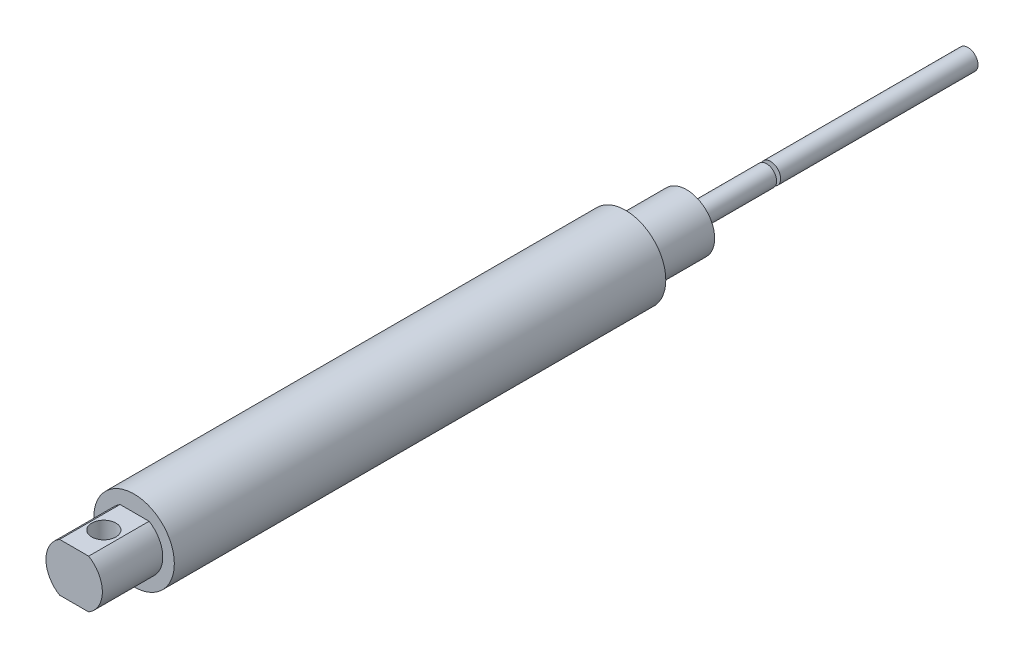
ISO-10303-21;
HEADER;
FILE_DESCRIPTION(('STEP AP214'),'2;1');
FILE_NAME('part.step','',(''),(''),'','','');
FILE_SCHEMA(('AUTOMOTIVE_DESIGN { 1 0 10303 214 1 1 1 1 }'));
ENDSEC;
DATA;
#1=APPLICATION_CONTEXT('core data for automotive mechanical design processes');
#2=APPLICATION_PROTOCOL_DEFINITION('international standard','automotive_design',2000,#1);
#3=PRODUCT_CONTEXT('',#1,'mechanical');
#4=PRODUCT('Part','Part','',(#3));
#5=PRODUCT_RELATED_PRODUCT_CATEGORY('part','',(#4));
#6=PRODUCT_DEFINITION_FORMATION('','',#4);
#7=PRODUCT_DEFINITION_CONTEXT('part definition',#1,'design');
#8=PRODUCT_DEFINITION('design','',#6,#7);
#9=PRODUCT_DEFINITION_SHAPE('','',#8);
#10=(LENGTH_UNIT() NAMED_UNIT(*) SI_UNIT(.MILLI.,.METRE.));
#11=(NAMED_UNIT(*) PLANE_ANGLE_UNIT() SI_UNIT($,.RADIAN.));
#12=(NAMED_UNIT(*) SI_UNIT($,.STERADIAN.) SOLID_ANGLE_UNIT());
#13=UNCERTAINTY_MEASURE_WITH_UNIT(LENGTH_MEASURE(1.E-05),#10,'distance_accuracy_value','');
#14=(GEOMETRIC_REPRESENTATION_CONTEXT(3) GLOBAL_UNCERTAINTY_ASSIGNED_CONTEXT((#13)) GLOBAL_UNIT_ASSIGNED_CONTEXT((#10,
#11,#12)) REPRESENTATION_CONTEXT('',''));
#15=CARTESIAN_POINT('',(0.,0.,0.));
#16=DIRECTION('',(0.,0.,1.));
#17=DIRECTION('',(1.,0.,0.));
#18=AXIS2_PLACEMENT_3D('',#15,#16,#17);
#19=CARTESIAN_POINT('',(0.,0.,-70.));
#20=DIRECTION('',(0.,0.,1.));
#21=DIRECTION('',(1.,0.,0.));
#22=AXIS2_PLACEMENT_3D('',#19,#20,#21);
#23=CYLINDRICAL_SURFACE('',#22,2.5);
#24=CARTESIAN_POINT('',(0.,0.,-70.));
#25=DIRECTION('',(0.,0.,-1.));
#26=DIRECTION('',(-1.,0.,0.));
#27=AXIS2_PLACEMENT_3D('',#24,#25,#26);
#28=CIRCLE('',#27,2.5);
#29=CARTESIAN_POINT('',(-2.5,0.,-70.));
#30=VERTEX_POINT('',#29);
#31=EDGE_CURVE('E12',#30,#30,#28,.T.);
#32=ORIENTED_EDGE('',*,*,#31,.F.);
#33=EDGE_LOOP('',(#32));
#34=FACE_BOUND('',#33,.T.);
#35=CARTESIAN_POINT('',(0.,0.,-21.));
#36=DIRECTION('',(0.,0.,-1.));
#37=DIRECTION('',(-1.,0.,0.));
#38=AXIS2_PLACEMENT_3D('',#35,#36,#37);
#39=CIRCLE('',#38,2.5);
#40=CARTESIAN_POINT('',(-2.5,0.,-21.));
#41=VERTEX_POINT('',#40);
#42=EDGE_CURVE('E58',#41,#41,#39,.T.);
#43=ORIENTED_EDGE('',*,*,#42,.T.);
#44=EDGE_LOOP('',(#43));
#45=FACE_BOUND('',#44,.T.);
#46=ADVANCED_FACE('F55',(#34,#45),#23,.T.);
#47=CARTESIAN_POINT('',(0.,0.,-70.));
#48=DIRECTION('',(0.,0.,-1.));
#49=DIRECTION('',(-1.,0.,0.));
#50=AXIS2_PLACEMENT_3D('',#47,#48,#49);
#51=PLANE('',#50);
#52=ORIENTED_EDGE('',*,*,#31,.T.);
#53=EDGE_LOOP('',(#52));
#54=FACE_BOUND('',#53,.T.);
#55=ADVANCED_FACE('F70',(#54),#51,.T.);
#56=CARTESIAN_POINT('',(0.,0.,-21.));
#57=DIRECTION('',(0.,0.,-1.));
#58=DIRECTION('',(-1.,0.,0.));
#59=AXIS2_PLACEMENT_3D('',#56,#57,#58);
#60=PLANE('',#59);
#61=ORIENTED_EDGE('',*,*,#42,.F.);
#62=EDGE_LOOP('',(#61));
#63=FACE_BOUND('',#62,.T.);
#64=ADVANCED_FACE('F68',(#63),#60,.F.);
#65=CLOSED_SHELL('',(#46,#55,#64));
#66=MANIFOLD_SOLID_BREP('B2',#65);
#67=CARTESIAN_POINT('',(0.,0.,152.));
#68=DIRECTION('',(0.,0.,-1.));
#69=DIRECTION('',(-1.,0.,0.));
#70=AXIS2_PLACEMENT_3D('',#67,#68,#69);
#71=CYLINDRICAL_SURFACE('',#70,10.);
#72=CARTESIAN_POINT('',(0.,0.,15.));
#73=DIRECTION('',(0.,0.,1.));
#74=DIRECTION('',(1.,0.,0.));
#75=AXIS2_PLACEMENT_3D('',#72,#73,#74);
#76=CIRCLE('',#75,10.);
#77=CARTESIAN_POINT('',(10.,0.,15.));
#78=VERTEX_POINT('',#77);
#79=EDGE_CURVE('E177',#78,#78,#76,.T.);
#80=ORIENTED_EDGE('',*,*,#79,.T.);
#81=EDGE_LOOP('',(#80));
#82=FACE_BOUND('',#81,.T.);
#83=CARTESIAN_POINT('',(0.,0.,137.));
#84=DIRECTION('',(0.,0.,1.));
#85=DIRECTION('',(1.,0.,0.));
#86=AXIS2_PLACEMENT_3D('',#83,#84,#85);
#87=CIRCLE('',#86,10.);
#88=CARTESIAN_POINT('',(10.,0.,137.));
#89=VERTEX_POINT('',#88);
#90=EDGE_CURVE('E171',#89,#89,#87,.T.);
#91=ORIENTED_EDGE('',*,*,#90,.F.);
#92=EDGE_LOOP('',(#91));
#93=FACE_BOUND('',#92,.T.);
#94=ADVANCED_FACE('F102',(#82,#93),#71,.T.);
#95=CARTESIAN_POINT('',(0.,6.,137.));
#96=DIRECTION('',(0.,-1.,0.));
#97=DIRECTION('',(0.,0.,-1.));
#98=AXIS2_PLACEMENT_3D('',#95,#96,#97);
#99=PLANE('',#98);
#100=CARTESIAN_POINT('',(0.,6.,144.5));
#101=DIRECTION('',(0.,1.,0.));
#102=DIRECTION('',(0.,0.,1.));
#103=AXIS2_PLACEMENT_3D('',#100,#101,#102);
#104=CIRCLE('',#103,3.00000000000001);
#105=CARTESIAN_POINT('',(0.,6.,147.5));
#106=VERTEX_POINT('',#105);
#107=EDGE_CURVE('E216',#106,#106,#104,.T.);
#108=ORIENTED_EDGE('',*,*,#107,.F.);
#109=EDGE_LOOP('',(#108));
#110=FACE_BOUND('',#109,.T.);
#111=DIRECTION('',(1.,0.,0.));
#112=VECTOR('',#111,1.);
#113=CARTESIAN_POINT('',(0.,6.,152.));
#114=LINE('',#113,#112);
#115=CARTESIAN_POINT('',(-3.47445059044201,6.,152.));
#116=VERTEX_POINT('',#115);
#117=CARTESIAN_POINT('',(3.73665196048596,6.,152.));
#118=VERTEX_POINT('',#117);
#119=EDGE_CURVE('E118',#116,#118,#114,.T.);
#120=ORIENTED_EDGE('',*,*,#119,.T.);
#121=DIRECTION('',(0.,0.,1.));
#122=VECTOR('',#121,1.);
#123=CARTESIAN_POINT('',(3.73665196048596,6.,137.));
#124=LINE('',#123,#122);
#125=CARTESIAN_POINT('',(3.73665196048596,6.,137.));
#126=VERTEX_POINT('',#125);
#127=EDGE_CURVE('E162',#126,#118,#124,.T.);
#128=ORIENTED_EDGE('',*,*,#127,.F.);
#129=DIRECTION('',(1.,0.,0.));
#130=VECTOR('',#129,1.);
#131=CARTESIAN_POINT('',(0.,6.,137.));
#132=LINE('',#131,#130);
#133=CARTESIAN_POINT('',(-3.47445059044201,6.,137.));
#134=VERTEX_POINT('',#133);
#135=EDGE_CURVE('E167',#134,#126,#132,.T.);
#136=ORIENTED_EDGE('',*,*,#135,.F.);
#137=DIRECTION('',(0.,0.,1.));
#138=VECTOR('',#137,1.);
#139=CARTESIAN_POINT('',(-3.47445059044201,6.,137.));
#140=LINE('',#139,#138);
#141=EDGE_CURVE('E110',#134,#116,#140,.T.);
#142=ORIENTED_EDGE('',*,*,#141,.T.);
#143=EDGE_LOOP('',(#120,#128,#136,#142));
#144=FACE_BOUND('',#143,.T.);
#145=ADVANCED_FACE('F199',(#110,#144),#99,.F.);
#146=CARTESIAN_POINT('',(0.131100685021975,0.,137.));
#147=DIRECTION('',(0.,0.,1.));
#148=DIRECTION('',(1.,0.,0.));
#149=AXIS2_PLACEMENT_3D('',#146,#147,#148);
#150=CYLINDRICAL_SURFACE('',#149,7.);
#151=CARTESIAN_POINT('',(0.131100685021975,0.,152.));
#152=DIRECTION('',(0.,0.,1.));
#153=DIRECTION('',(1.,0.,0.));
#154=AXIS2_PLACEMENT_3D('',#151,#152,#153);
#155=CIRCLE('',#154,7.);
#156=CARTESIAN_POINT('',(-3.47445059044201,-6.,152.));
#157=VERTEX_POINT('',#156);
#158=EDGE_CURVE('E169',#116,#157,#155,.T.);
#159=ORIENTED_EDGE('',*,*,#158,.F.);
#160=ORIENTED_EDGE('',*,*,#141,.F.);
#161=CARTESIAN_POINT('',(0.131100685021975,0.,137.));
#162=DIRECTION('',(0.,0.,1.));
#163=DIRECTION('',(1.,0.,0.));
#164=AXIS2_PLACEMENT_3D('',#161,#162,#163);
#165=CIRCLE('',#164,7.);
#166=CARTESIAN_POINT('',(-3.47445059044201,-6.,137.));
#167=VERTEX_POINT('',#166);
#168=EDGE_CURVE('E156',#134,#167,#165,.T.);
#169=ORIENTED_EDGE('',*,*,#168,.T.);
#170=DIRECTION('',(0.,0.,1.));
#171=VECTOR('',#170,1.);
#172=CARTESIAN_POINT('',(-3.47445059044201,-6.,137.));
#173=LINE('',#172,#171);
#174=EDGE_CURVE('E154',#167,#157,#173,.T.);
#175=ORIENTED_EDGE('',*,*,#174,.T.);
#176=EDGE_LOOP('',(#159,#160,#169,#175));
#177=FACE_BOUND('',#176,.T.);
#178=ADVANCED_FACE('F182',(#177),#150,.T.);
#179=CARTESIAN_POINT('',(0.,-6.,137.));
#180=DIRECTION('',(0.,-1.,0.));
#181=DIRECTION('',(1.,0.,0.));
#182=AXIS2_PLACEMENT_3D('',#179,#180,#181);
#183=PLANE('',#182);
#184=CARTESIAN_POINT('',(0.,-6.,144.5));
#185=DIRECTION('',(0.,-1.,0.));
#186=DIRECTION('',(1.,0.,0.));
#187=AXIS2_PLACEMENT_3D('',#184,#185,#186);
#188=CIRCLE('',#187,3.00000000000001);
#189=CARTESIAN_POINT('',(3.00000000000001,-6.,144.5));
#190=VERTEX_POINT('',#189);
#191=EDGE_CURVE('E105',#190,#190,#188,.T.);
#192=ORIENTED_EDGE('',*,*,#191,.F.);
#193=EDGE_LOOP('',(#192));
#194=FACE_BOUND('',#193,.T.);
#195=DIRECTION('',(1.,0.,0.));
#196=VECTOR('',#195,1.);
#197=CARTESIAN_POINT('',(0.,-6.,152.));
#198=LINE('',#197,#196);
#199=CARTESIAN_POINT('',(3.73665196048596,-6.,152.));
#200=VERTEX_POINT('',#199);
#201=EDGE_CURVE('E179',#157,#200,#198,.T.);
#202=ORIENTED_EDGE('',*,*,#201,.F.);
#203=ORIENTED_EDGE('',*,*,#174,.F.);
#204=DIRECTION('',(1.,0.,0.));
#205=VECTOR('',#204,1.);
#206=CARTESIAN_POINT('',(0.,-6.,137.));
#207=LINE('',#206,#205);
#208=CARTESIAN_POINT('',(3.73665196048596,-6.,137.));
#209=VERTEX_POINT('',#208);
#210=EDGE_CURVE('E149',#167,#209,#207,.T.);
#211=ORIENTED_EDGE('',*,*,#210,.T.);
#212=DIRECTION('',(0.,0.,1.));
#213=VECTOR('',#212,1.);
#214=CARTESIAN_POINT('',(3.73665196048596,-6.,137.));
#215=LINE('',#214,#213);
#216=EDGE_CURVE('E152',#209,#200,#215,.T.);
#217=ORIENTED_EDGE('',*,*,#216,.T.);
#218=EDGE_LOOP('',(#202,#203,#211,#217));
#219=FACE_BOUND('',#218,.T.);
#220=ADVANCED_FACE('F151',(#194,#219),#183,.T.);
#221=EDGE_CURVE('E160',#200,#118,#155,.T.);
#222=ORIENTED_EDGE('',*,*,#221,.F.);
#223=ORIENTED_EDGE('',*,*,#216,.F.);
#224=EDGE_CURVE('E144',#209,#126,#165,.T.);
#225=ORIENTED_EDGE('',*,*,#224,.T.);
#226=ORIENTED_EDGE('',*,*,#127,.T.);
#227=EDGE_LOOP('',(#222,#223,#225,#226));
#228=FACE_BOUND('',#227,.T.);
#229=ADVANCED_FACE('F158',(#228),#150,.T.);
#230=CARTESIAN_POINT('',(0.,0.,137.));
#231=DIRECTION('',(0.,0.,1.));
#232=DIRECTION('',(1.,0.,0.));
#233=AXIS2_PLACEMENT_3D('',#230,#231,#232);
#234=PLANE('',#233);
#235=ORIENTED_EDGE('',*,*,#135,.T.);
#236=ORIENTED_EDGE('',*,*,#224,.F.);
#237=ORIENTED_EDGE('',*,*,#210,.F.);
#238=ORIENTED_EDGE('',*,*,#168,.F.);
#239=EDGE_LOOP('',(#235,#236,#237,#238));
#240=FACE_BOUND('',#239,.T.);
#241=ORIENTED_EDGE('',*,*,#90,.T.);
#242=EDGE_LOOP('',(#241));
#243=FACE_BOUND('',#242,.T.);
#244=ADVANCED_FACE('F165',(#240,#243),#234,.T.);
#245=CARTESIAN_POINT('',(0.,0.,152.));
#246=DIRECTION('',(0.,0.,1.));
#247=DIRECTION('',(1.,0.,0.));
#248=AXIS2_PLACEMENT_3D('',#245,#246,#247);
#249=PLANE('',#248);
#250=ORIENTED_EDGE('',*,*,#119,.F.);
#251=ORIENTED_EDGE('',*,*,#158,.T.);
#252=ORIENTED_EDGE('',*,*,#201,.T.);
#253=ORIENTED_EDGE('',*,*,#221,.T.);
#254=EDGE_LOOP('',(#250,#251,#252,#253));
#255=FACE_BOUND('',#254,.T.);
#256=ADVANCED_FACE('F185',(#255),#249,.T.);
#257=CARTESIAN_POINT('',(0.,0.,15.));
#258=DIRECTION('',(0.,0.,1.));
#259=DIRECTION('',(1.,0.,0.));
#260=AXIS2_PLACEMENT_3D('',#257,#258,#259);
#261=PLANE('',#260);
#262=ORIENTED_EDGE('',*,*,#79,.F.);
#263=EDGE_LOOP('',(#262));
#264=FACE_BOUND('',#263,.T.);
#265=CARTESIAN_POINT('',(0.131100685021975,0.,15.));
#266=DIRECTION('',(0.,0.,1.));
#267=DIRECTION('',(1.,0.,0.));
#268=AXIS2_PLACEMENT_3D('',#265,#266,#267);
#269=CIRCLE('',#268,7.);
#270=CARTESIAN_POINT('',(7.13110068502198,0.,15.));
#271=VERTEX_POINT('',#270);
#272=EDGE_CURVE('E208',#271,#271,#269,.T.);
#273=ORIENTED_EDGE('',*,*,#272,.T.);
#274=EDGE_LOOP('',(#273));
#275=FACE_BOUND('',#274,.T.);
#276=ADVANCED_FACE('F187',(#264,#275),#261,.F.);
#277=CARTESIAN_POINT('',(0.131100685021975,0.,15.));
#278=DIRECTION('',(0.,0.,-1.));
#279=DIRECTION('',(-1.,0.,0.));
#280=AXIS2_PLACEMENT_3D('',#277,#278,#279);
#281=CYLINDRICAL_SURFACE('',#280,7.);
#282=ORIENTED_EDGE('',*,*,#272,.F.);
#283=EDGE_LOOP('',(#282));
#284=FACE_BOUND('',#283,.T.);
#285=CARTESIAN_POINT('',(0.131100685021975,0.,0.));
#286=DIRECTION('',(0.,0.,1.));
#287=DIRECTION('',(1.,0.,0.));
#288=AXIS2_PLACEMENT_3D('',#285,#286,#287);
#289=CIRCLE('',#288,7.);
#290=CARTESIAN_POINT('',(7.13110068502198,0.,0.));
#291=VERTEX_POINT('',#290);
#292=EDGE_CURVE('E211',#291,#291,#289,.T.);
#293=ORIENTED_EDGE('',*,*,#292,.T.);
#294=EDGE_LOOP('',(#293));
#295=FACE_BOUND('',#294,.T.);
#296=ADVANCED_FACE('F193',(#284,#295),#281,.T.);
#297=CARTESIAN_POINT('',(0.,0.,0.));
#298=DIRECTION('',(0.,0.,1.));
#299=DIRECTION('',(1.,0.,0.));
#300=AXIS2_PLACEMENT_3D('',#297,#298,#299);
#301=PLANE('',#300);
#302=CARTESIAN_POINT('',(0.,0.,0.));
#303=DIRECTION('',(0.,0.,-1.));
#304=DIRECTION('',(-1.,0.,0.));
#305=AXIS2_PLACEMENT_3D('',#302,#303,#304);
#306=CIRCLE('',#305,2.5);
#307=CARTESIAN_POINT('',(-2.5,0.,0.));
#308=VERTEX_POINT('',#307);
#309=EDGE_CURVE('E53',#308,#308,#306,.T.);
#310=ORIENTED_EDGE('',*,*,#309,.F.);
#311=EDGE_LOOP('',(#310));
#312=FACE_BOUND('',#311,.T.);
#313=ORIENTED_EDGE('',*,*,#292,.F.);
#314=EDGE_LOOP('',(#313));
#315=FACE_BOUND('',#314,.T.);
#316=ADVANCED_FACE('F232',(#312,#315),#301,.F.);
#317=CARTESIAN_POINT('',(0.,-10.,144.5));
#318=DIRECTION('',(0.,1.,0.));
#319=DIRECTION('',(0.,0.,1.));
#320=AXIS2_PLACEMENT_3D('',#317,#318,#319);
#321=CYLINDRICAL_SURFACE('',#320,3.00000000000001);
#322=ORIENTED_EDGE('',*,*,#191,.T.);
#323=EDGE_LOOP('',(#322));
#324=FACE_BOUND('',#323,.T.);
#325=ORIENTED_EDGE('',*,*,#107,.T.);
#326=EDGE_LOOP('',(#325));
#327=FACE_BOUND('',#326,.T.);
#328=ADVANCED_FACE('F228',(#324,#327),#321,.F.);
#329=CARTESIAN_POINT('',(0.,0.,-20.));
#330=DIRECTION('',(0.,0.,1.));
#331=DIRECTION('',(1.,0.,0.));
#332=AXIS2_PLACEMENT_3D('',#329,#330,#331);
#333=CYLINDRICAL_SURFACE('',#332,2.5);
#334=CARTESIAN_POINT('',(0.,0.,-20.));
#335=DIRECTION('',(0.,0.,-1.));
#336=DIRECTION('',(-1.,0.,0.));
#337=AXIS2_PLACEMENT_3D('',#334,#335,#336);
#338=CIRCLE('',#337,2.5);
#339=CARTESIAN_POINT('',(-2.5,0.,-20.));
#340=VERTEX_POINT('',#339);
#341=EDGE_CURVE('E218',#340,#340,#338,.T.);
#342=ORIENTED_EDGE('',*,*,#341,.F.);
#343=EDGE_LOOP('',(#342));
#344=FACE_BOUND('',#343,.T.);
#345=ORIENTED_EDGE('',*,*,#309,.T.);
#346=EDGE_LOOP('',(#345));
#347=FACE_BOUND('',#346,.T.);
#348=ADVANCED_FACE('F225',(#344,#347),#333,.T.);
#349=CARTESIAN_POINT('',(0.,0.,-20.));
#350=DIRECTION('',(0.,0.,-1.));
#351=DIRECTION('',(-1.,0.,0.));
#352=AXIS2_PLACEMENT_3D('',#349,#350,#351);
#353=PLANE('',#352);
#354=ORIENTED_EDGE('',*,*,#341,.T.);
#355=EDGE_LOOP('',(#354));
#356=FACE_BOUND('',#355,.T.);
#357=ADVANCED_FACE('F223',(#356),#353,.T.);
#358=CLOSED_SHELL('',(#94,#145,#178,#220,#229,#244,#256,#276,#296,#316,#328,#348,#357));
#359=MANIFOLD_SOLID_BREP('B7',#358);
#360=ADVANCED_BREP_SHAPE_REPRESENTATION('',(#18,#66,#359),#14);
#361=SHAPE_DEFINITION_REPRESENTATION(#9,#360);
ENDSEC;
END-ISO-10303-21;
